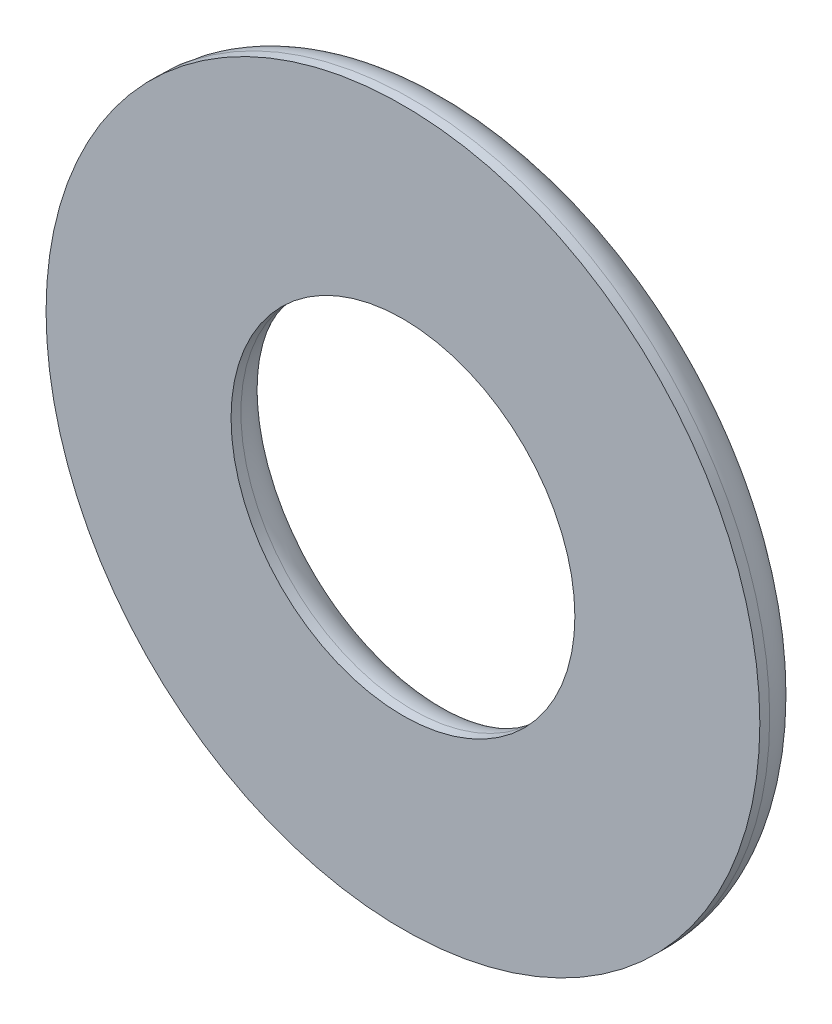
ISO-10303-21;
HEADER;
FILE_DESCRIPTION(('STEP AP214'),'2;1');
FILE_NAME('part.step','',(''),(''),'','','');
FILE_SCHEMA(('AUTOMOTIVE_DESIGN { 1 0 10303 214 1 1 1 1 }'));
ENDSEC;
DATA;
#1=APPLICATION_CONTEXT('core data for automotive mechanical design processes');
#2=APPLICATION_PROTOCOL_DEFINITION('international standard','automotive_design',2000,#1);
#3=PRODUCT_CONTEXT('',#1,'mechanical');
#4=PRODUCT('Part','Part','',(#3));
#5=PRODUCT_RELATED_PRODUCT_CATEGORY('part','',(#4));
#6=PRODUCT_DEFINITION_FORMATION('','',#4);
#7=PRODUCT_DEFINITION_CONTEXT('part definition',#1,'design');
#8=PRODUCT_DEFINITION('design','',#6,#7);
#9=PRODUCT_DEFINITION_SHAPE('','',#8);
#10=(LENGTH_UNIT() NAMED_UNIT(*) SI_UNIT(.MILLI.,.METRE.));
#11=(NAMED_UNIT(*) PLANE_ANGLE_UNIT() SI_UNIT($,.RADIAN.));
#12=(NAMED_UNIT(*) SI_UNIT($,.STERADIAN.) SOLID_ANGLE_UNIT());
#13=UNCERTAINTY_MEASURE_WITH_UNIT(LENGTH_MEASURE(1.E-05),#10,'distance_accuracy_value','');
#14=(GEOMETRIC_REPRESENTATION_CONTEXT(3) GLOBAL_UNCERTAINTY_ASSIGNED_CONTEXT((#13)) GLOBAL_UNIT_ASSIGNED_CONTEXT((#10,
#11,#12)) REPRESENTATION_CONTEXT('',''));
#15=CARTESIAN_POINT('',(0.,0.,0.));
#16=DIRECTION('',(0.,0.,1.));
#17=DIRECTION('',(1.,0.,0.));
#18=AXIS2_PLACEMENT_3D('',#15,#16,#17);
#19=CARTESIAN_POINT('',(24.548886356747,5.38318285887093,-19.812));
#20=DIRECTION('',(0.,0.,1.));
#21=DIRECTION('',(1.,0.,0.));
#22=AXIS2_PLACEMENT_3D('',#19,#20,#21);
#23=TOROIDAL_SURFACE('',#22,4.09687021175771,0.508);
#24=CARTESIAN_POINT('',(24.548886356747,5.38318285887093,-20.32));
#25=DIRECTION('',(0.,0.,-1.));
#26=DIRECTION('',(1.,0.,0.));
#27=AXIS2_PLACEMENT_3D('',#24,#25,#26);
#28=CIRCLE('',#27,4.09687021175771);
#29=CARTESIAN_POINT('',(28.6457565685047,5.38318285887093,-20.32));
#30=VERTEX_POINT('',#29);
#31=EDGE_CURVE('E41',#30,#30,#28,.F.);
#32=ORIENTED_EDGE('',*,*,#31,.T.);
#33=EDGE_LOOP('',(#32));
#34=FACE_BOUND('',#33,.T.);
#35=CARTESIAN_POINT('',(24.548886356747,5.38318285887093,-19.812));
#36=DIRECTION('',(0.,0.,-1.));
#37=DIRECTION('',(1.,0.,0.));
#38=AXIS2_PLACEMENT_3D('',#35,#36,#37);
#39=CIRCLE('',#38,4.60487021175771);
#40=CARTESIAN_POINT('',(29.1537565685047,5.38318285887093,-19.812));
#41=VERTEX_POINT('',#40);
#42=EDGE_CURVE('E50',#41,#41,#39,.T.);
#43=ORIENTED_EDGE('',*,*,#42,.T.);
#44=EDGE_LOOP('',(#43));
#45=FACE_BOUND('',#44,.T.);
#46=ADVANCED_FACE('F33',(#34,#45),#23,.T.);
#47=CARTESIAN_POINT('',(24.548886356747,5.38318285887093,-20.32));
#48=DIRECTION('',(0.,0.,1.));
#49=DIRECTION('',(1.,0.,0.));
#50=AXIS2_PLACEMENT_3D('',#47,#48,#49);
#51=CYLINDRICAL_SURFACE('',#50,4.60487021175771);
#52=CARTESIAN_POINT('',(24.548886356747,5.38318285887093,-19.685));
#53=DIRECTION('',(0.,0.,-1.));
#54=DIRECTION('',(-1.,0.,0.));
#55=AXIS2_PLACEMENT_3D('',#52,#53,#54);
#56=CIRCLE('',#55,4.60487021175771);
#57=CARTESIAN_POINT('',(19.9440161449893,5.38318285887093,-19.685));
#58=VERTEX_POINT('',#57);
#59=EDGE_CURVE('E53',#58,#58,#56,.F.);
#60=ORIENTED_EDGE('',*,*,#59,.F.);
#61=EDGE_LOOP('',(#60));
#62=FACE_BOUND('',#61,.T.);
#63=ORIENTED_EDGE('',*,*,#42,.F.);
#64=EDGE_LOOP('',(#63));
#65=FACE_BOUND('',#64,.T.);
#66=ADVANCED_FACE('F71',(#62,#65),#51,.T.);
#67=CARTESIAN_POINT('',(24.548886356747,5.38318285887093,-20.32));
#68=DIRECTION('',(0.,0.,1.));
#69=DIRECTION('',(1.,0.,0.));
#70=AXIS2_PLACEMENT_3D('',#67,#68,#69);
#71=PLANE('',#70);
#72=ORIENTED_EDGE('',*,*,#31,.F.);
#73=EDGE_LOOP('',(#72));
#74=FACE_BOUND('',#73,.T.);
#75=CARTESIAN_POINT('',(24.548886356747,5.38318285887093,-20.32));
#76=DIRECTION('',(0.,0.,-1.));
#77=DIRECTION('',(1.,0.,0.));
#78=AXIS2_PLACEMENT_3D('',#75,#76,#77);
#79=CIRCLE('',#78,2.72612228916813);
#80=CARTESIAN_POINT('',(27.2750086459151,5.38318285887093,-20.32));
#81=VERTEX_POINT('',#80);
#82=EDGE_CURVE('E45',#81,#81,#79,.T.);
#83=ORIENTED_EDGE('',*,*,#82,.F.);
#84=EDGE_LOOP('',(#83));
#85=FACE_BOUND('',#84,.T.);
#86=ADVANCED_FACE('F76',(#74,#85),#71,.F.);
#87=CARTESIAN_POINT('',(24.548886356747,5.38318285887093,-19.812));
#88=DIRECTION('',(0.,0.,1.));
#89=DIRECTION('',(1.,0.,0.));
#90=AXIS2_PLACEMENT_3D('',#87,#88,#89);
#91=TOROIDAL_SURFACE('',#90,2.72612228916813,0.508);
#92=CARTESIAN_POINT('',(24.548886356747,5.38318285887093,-19.812));
#93=DIRECTION('',(0.,0.,-1.));
#94=DIRECTION('',(1.,0.,0.));
#95=AXIS2_PLACEMENT_3D('',#92,#93,#94);
#96=CIRCLE('',#95,2.21812228916813);
#97=CARTESIAN_POINT('',(26.7670086459151,5.38318285887093,-19.812));
#98=VERTEX_POINT('',#97);
#99=EDGE_CURVE('E10',#98,#98,#96,.F.);
#100=ORIENTED_EDGE('',*,*,#99,.T.);
#101=EDGE_LOOP('',(#100));
#102=FACE_BOUND('',#101,.T.);
#103=ORIENTED_EDGE('',*,*,#82,.T.);
#104=EDGE_LOOP('',(#103));
#105=FACE_BOUND('',#104,.T.);
#106=ADVANCED_FACE('F35',(#102,#105),#91,.T.);
#107=CARTESIAN_POINT('',(24.548886356747,5.38318285887093,-20.32));
#108=DIRECTION('',(0.,0.,1.));
#109=DIRECTION('',(1.,0.,0.));
#110=AXIS2_PLACEMENT_3D('',#107,#108,#109);
#111=CYLINDRICAL_SURFACE('',#110,2.21812228916813);
#112=CARTESIAN_POINT('',(24.548886356747,5.38318285887093,-19.685));
#113=DIRECTION('',(0.,0.,-1.));
#114=DIRECTION('',(-1.,0.,0.));
#115=AXIS2_PLACEMENT_3D('',#112,#113,#114);
#116=CIRCLE('',#115,2.21812228916813);
#117=CARTESIAN_POINT('',(22.3307640675789,5.38318285887093,-19.685));
#118=VERTEX_POINT('',#117);
#119=EDGE_CURVE('E37',#118,#118,#116,.F.);
#120=ORIENTED_EDGE('',*,*,#119,.T.);
#121=EDGE_LOOP('',(#120));
#122=FACE_BOUND('',#121,.T.);
#123=ORIENTED_EDGE('',*,*,#99,.F.);
#124=EDGE_LOOP('',(#123));
#125=FACE_BOUND('',#124,.T.);
#126=ADVANCED_FACE('F60',(#122,#125),#111,.F.);
#127=CARTESIAN_POINT('',(24.548886356747,5.38318285887093,-19.685));
#128=DIRECTION('',(0.,0.,-1.));
#129=DIRECTION('',(-1.,0.,0.));
#130=AXIS2_PLACEMENT_3D('',#127,#128,#129);
#131=PLANE('',#130);
#132=ORIENTED_EDGE('',*,*,#59,.T.);
#133=EDGE_LOOP('',(#132));
#134=FACE_BOUND('',#133,.T.);
#135=ORIENTED_EDGE('',*,*,#119,.F.);
#136=EDGE_LOOP('',(#135));
#137=FACE_BOUND('',#136,.T.);
#138=ADVANCED_FACE('F63',(#134,#137),#131,.F.);
#139=CLOSED_SHELL('',(#46,#66,#86,#106,#126,#138));
#140=MANIFOLD_SOLID_BREP('B2',#139);
#141=ADVANCED_BREP_SHAPE_REPRESENTATION('',(#18,#140),#14);
#142=SHAPE_DEFINITION_REPRESENTATION(#9,#141);
ENDSEC;
END-ISO-10303-21;
